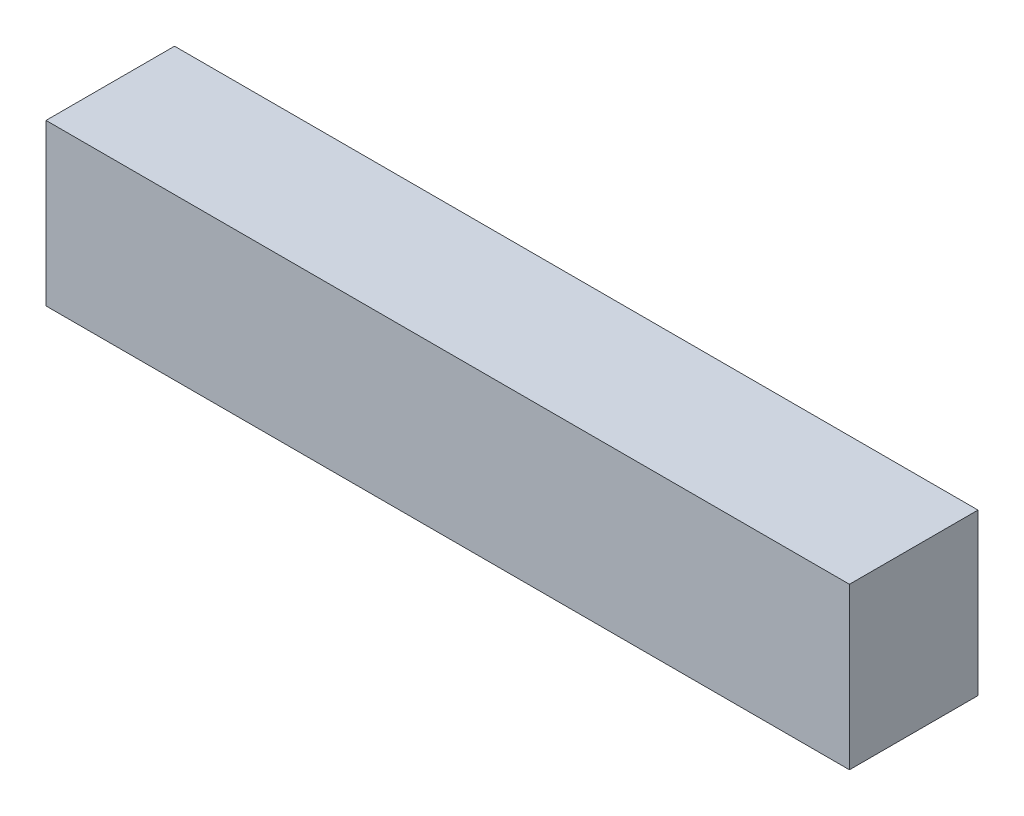
ISO-10303-21;
HEADER;
FILE_DESCRIPTION(('STEP AP214'),'2;1');
FILE_NAME('part.step','',(''),(''),'','','');
FILE_SCHEMA(('AUTOMOTIVE_DESIGN { 1 0 10303 214 1 1 1 1 }'));
ENDSEC;
DATA;
#1=APPLICATION_CONTEXT('core data for automotive mechanical design processes');
#2=APPLICATION_PROTOCOL_DEFINITION('international standard','automotive_design',2000,#1);
#3=PRODUCT_CONTEXT('',#1,'mechanical');
#4=PRODUCT('Part','Part','',(#3));
#5=PRODUCT_RELATED_PRODUCT_CATEGORY('part','',(#4));
#6=PRODUCT_DEFINITION_FORMATION('','',#4);
#7=PRODUCT_DEFINITION_CONTEXT('part definition',#1,'design');
#8=PRODUCT_DEFINITION('design','',#6,#7);
#9=PRODUCT_DEFINITION_SHAPE('','',#8);
#10=(LENGTH_UNIT() NAMED_UNIT(*) SI_UNIT(.MILLI.,.METRE.));
#11=(NAMED_UNIT(*) PLANE_ANGLE_UNIT() SI_UNIT($,.RADIAN.));
#12=(NAMED_UNIT(*) SI_UNIT($,.STERADIAN.) SOLID_ANGLE_UNIT());
#13=UNCERTAINTY_MEASURE_WITH_UNIT(LENGTH_MEASURE(1.E-05),#10,'distance_accuracy_value','');
#14=(GEOMETRIC_REPRESENTATION_CONTEXT(3) GLOBAL_UNCERTAINTY_ASSIGNED_CONTEXT((#13)) GLOBAL_UNIT_ASSIGNED_CONTEXT((#10,
#11,#12)) REPRESENTATION_CONTEXT('',''));
#15=CARTESIAN_POINT('',(0.,0.,0.));
#16=DIRECTION('',(0.,0.,1.));
#17=DIRECTION('',(1.,0.,0.));
#18=AXIS2_PLACEMENT_3D('',#15,#16,#17);
#19=CARTESIAN_POINT('',(0.,0.,0.));
#20=DIRECTION('',(0.,0.,-1.));
#21=DIRECTION('',(-1.,0.,0.));
#22=AXIS2_PLACEMENT_3D('',#19,#20,#21);
#23=PLANE('',#22);
#24=DIRECTION('',(0.,1.,0.));
#25=VECTOR('',#24,1.);
#26=CARTESIAN_POINT('',(0.,0.,0.));
#27=LINE('',#26,#25);
#28=CARTESIAN_POINT('',(0.,0.,0.));
#29=VERTEX_POINT('',#28);
#30=CARTESIAN_POINT('',(0.,10.,0.));
#31=VERTEX_POINT('',#30);
#32=EDGE_CURVE('E111',#29,#31,#27,.T.);
#33=ORIENTED_EDGE('',*,*,#32,.T.);
#34=DIRECTION('',(1.,0.,0.));
#35=VECTOR('',#34,1.);
#36=CARTESIAN_POINT('',(0.,10.,0.));
#37=LINE('',#36,#35);
#38=CARTESIAN_POINT('',(50.,10.,0.));
#39=VERTEX_POINT('',#38);
#40=EDGE_CURVE('E141',#31,#39,#37,.T.);
#41=ORIENTED_EDGE('',*,*,#40,.T.);
#42=DIRECTION('',(0.,1.,0.));
#43=VECTOR('',#42,1.);
#44=CARTESIAN_POINT('',(50.,0.,0.));
#45=LINE('',#44,#43);
#46=CARTESIAN_POINT('',(50.,0.,0.));
#47=VERTEX_POINT('',#46);
#48=EDGE_CURVE('E144',#47,#39,#45,.T.);
#49=ORIENTED_EDGE('',*,*,#48,.F.);
#50=DIRECTION('',(1.,0.,0.));
#51=VECTOR('',#50,1.);
#52=CARTESIAN_POINT('',(0.,0.,0.));
#53=LINE('',#52,#51);
#54=EDGE_CURVE('E88',#29,#47,#53,.T.);
#55=ORIENTED_EDGE('',*,*,#54,.F.);
#56=EDGE_LOOP('',(#33,#41,#49,#55));
#57=FACE_BOUND('',#56,.T.);
#58=CARTESIAN_POINT('',(44.5,5.,0.));
#59=DIRECTION('',(0.,0.,-1.));
#60=DIRECTION('',(-1.,0.,0.));
#61=AXIS2_PLACEMENT_3D('',#58,#59,#60);
#62=CIRCLE('',#61,1.5);
#63=CARTESIAN_POINT('',(43.,5.,0.));
#64=VERTEX_POINT('',#63);
#65=EDGE_CURVE('E134',#64,#64,#62,.T.);
#66=ORIENTED_EDGE('',*,*,#65,.F.);
#67=EDGE_LOOP('',(#66));
#68=FACE_BOUND('',#67,.T.);
#69=CARTESIAN_POINT('',(5.5,5.,0.));
#70=DIRECTION('',(0.,0.,1.));
#71=DIRECTION('',(1.,0.,0.));
#72=AXIS2_PLACEMENT_3D('',#69,#70,#71);
#73=CIRCLE('',#72,1.5);
#74=CARTESIAN_POINT('',(7.,5.,0.));
#75=VERTEX_POINT('',#74);
#76=EDGE_CURVE('E131',#75,#75,#73,.T.);
#77=ORIENTED_EDGE('',*,*,#76,.T.);
#78=EDGE_LOOP('',(#77));
#79=FACE_BOUND('',#78,.T.);
#80=ADVANCED_FACE('F69',(#57,#68,#79),#23,.T.);
#81=CARTESIAN_POINT('',(0.,0.,6.));
#82=DIRECTION('',(-1.,0.,0.));
#83=DIRECTION('',(0.,0.,1.));
#84=AXIS2_PLACEMENT_3D('',#81,#82,#83);
#85=PLANE('',#84);
#86=ORIENTED_EDGE('',*,*,#32,.F.);
#87=DIRECTION('',(0.,0.,-1.));
#88=VECTOR('',#87,1.);
#89=CARTESIAN_POINT('',(0.,0.,6.));
#90=LINE('',#89,#88);
#91=CARTESIAN_POINT('',(0.,0.,8.));
#92=VERTEX_POINT('',#91);
#93=EDGE_CURVE('E12',#92,#29,#90,.T.);
#94=ORIENTED_EDGE('',*,*,#93,.F.);
#95=DIRECTION('',(0.,-1.,0.));
#96=VECTOR('',#95,1.);
#97=CARTESIAN_POINT('',(0.,0.,8.));
#98=LINE('',#97,#96);
#99=CARTESIAN_POINT('',(0.,10.,8.));
#100=VERTEX_POINT('',#99);
#101=EDGE_CURVE('E109',#100,#92,#98,.T.);
#102=ORIENTED_EDGE('',*,*,#101,.F.);
#103=DIRECTION('',(0.,0.,-1.));
#104=VECTOR('',#103,1.);
#105=CARTESIAN_POINT('',(0.,10.,6.));
#106=LINE('',#105,#104);
#107=EDGE_CURVE('E73',#100,#31,#106,.T.);
#108=ORIENTED_EDGE('',*,*,#107,.T.);
#109=EDGE_LOOP('',(#86,#94,#102,#108));
#110=FACE_BOUND('',#109,.T.);
#111=ADVANCED_FACE('F71',(#110),#85,.T.);
#112=CARTESIAN_POINT('',(0.,0.,6.));
#113=DIRECTION('',(0.,1.,0.));
#114=DIRECTION('',(0.,0.,1.));
#115=AXIS2_PLACEMENT_3D('',#112,#113,#114);
#116=PLANE('',#115);
#117=ORIENTED_EDGE('',*,*,#54,.T.);
#118=DIRECTION('',(0.,0.,-1.));
#119=VECTOR('',#118,1.);
#120=CARTESIAN_POINT('',(50.,0.,6.));
#121=LINE('',#120,#119);
#122=CARTESIAN_POINT('',(50.,0.,8.));
#123=VERTEX_POINT('',#122);
#124=EDGE_CURVE('E78',#123,#47,#121,.T.);
#125=ORIENTED_EDGE('',*,*,#124,.F.);
#126=DIRECTION('',(1.,0.,0.));
#127=VECTOR('',#126,1.);
#128=CARTESIAN_POINT('',(0.,0.,8.));
#129=LINE('',#128,#127);
#130=EDGE_CURVE('E113',#92,#123,#129,.T.);
#131=ORIENTED_EDGE('',*,*,#130,.F.);
#132=ORIENTED_EDGE('',*,*,#93,.T.);
#133=EDGE_LOOP('',(#117,#125,#131,#132));
#134=FACE_BOUND('',#133,.T.);
#135=ADVANCED_FACE('F114',(#134),#116,.F.);
#136=CARTESIAN_POINT('',(50.,0.,6.));
#137=DIRECTION('',(-1.,0.,0.));
#138=DIRECTION('',(0.,0.,1.));
#139=AXIS2_PLACEMENT_3D('',#136,#137,#138);
#140=PLANE('',#139);
#141=ORIENTED_EDGE('',*,*,#48,.T.);
#142=DIRECTION('',(0.,0.,-1.));
#143=VECTOR('',#142,1.);
#144=CARTESIAN_POINT('',(50.,10.,6.));
#145=LINE('',#144,#143);
#146=CARTESIAN_POINT('',(50.,10.,8.));
#147=VERTEX_POINT('',#146);
#148=EDGE_CURVE('E148',#147,#39,#145,.T.);
#149=ORIENTED_EDGE('',*,*,#148,.F.);
#150=DIRECTION('',(0.,1.,0.));
#151=VECTOR('',#150,1.);
#152=CARTESIAN_POINT('',(50.,0.,8.));
#153=LINE('',#152,#151);
#154=EDGE_CURVE('E118',#123,#147,#153,.T.);
#155=ORIENTED_EDGE('',*,*,#154,.F.);
#156=ORIENTED_EDGE('',*,*,#124,.T.);
#157=EDGE_LOOP('',(#141,#149,#155,#156));
#158=FACE_BOUND('',#157,.T.);
#159=ADVANCED_FACE('F156',(#158),#140,.F.);
#160=CARTESIAN_POINT('',(0.,10.,6.));
#161=DIRECTION('',(0.,1.,0.));
#162=DIRECTION('',(0.,0.,1.));
#163=AXIS2_PLACEMENT_3D('',#160,#161,#162);
#164=PLANE('',#163);
#165=ORIENTED_EDGE('',*,*,#40,.F.);
#166=ORIENTED_EDGE('',*,*,#107,.F.);
#167=DIRECTION('',(-1.,0.,0.));
#168=VECTOR('',#167,1.);
#169=CARTESIAN_POINT('',(0.,10.,8.));
#170=LINE('',#169,#168);
#171=EDGE_CURVE('E123',#147,#100,#170,.T.);
#172=ORIENTED_EDGE('',*,*,#171,.F.);
#173=ORIENTED_EDGE('',*,*,#148,.T.);
#174=EDGE_LOOP('',(#165,#166,#172,#173));
#175=FACE_BOUND('',#174,.T.);
#176=ADVANCED_FACE('F151',(#175),#164,.T.);
#177=CARTESIAN_POINT('',(44.5,5.,6.));
#178=DIRECTION('',(0.,0.,-1.));
#179=DIRECTION('',(-1.,0.,0.));
#180=AXIS2_PLACEMENT_3D('',#177,#178,#179);
#181=CYLINDRICAL_SURFACE('',#180,1.5);
#182=CARTESIAN_POINT('',(44.5,5.,6.));
#183=DIRECTION('',(0.,0.,-1.));
#184=DIRECTION('',(-1.,0.,0.));
#185=AXIS2_PLACEMENT_3D('',#182,#183,#184);
#186=CIRCLE('',#185,1.5);
#187=CARTESIAN_POINT('',(43.,5.,6.));
#188=VERTEX_POINT('',#187);
#189=EDGE_CURVE('E135',#188,#188,#186,.T.);
#190=ORIENTED_EDGE('',*,*,#189,.F.);
#191=EDGE_LOOP('',(#190));
#192=FACE_BOUND('',#191,.T.);
#193=ORIENTED_EDGE('',*,*,#65,.T.);
#194=EDGE_LOOP('',(#193));
#195=FACE_BOUND('',#194,.T.);
#196=ADVANCED_FACE('F163',(#192,#195),#181,.F.);
#197=CARTESIAN_POINT('',(5.5,5.,6.));
#198=DIRECTION('',(0.,0.,-1.));
#199=DIRECTION('',(-1.,0.,0.));
#200=AXIS2_PLACEMENT_3D('',#197,#198,#199);
#201=CYLINDRICAL_SURFACE('',#200,1.5);
#202=CARTESIAN_POINT('',(5.5,5.,6.));
#203=DIRECTION('',(0.,0.,1.));
#204=DIRECTION('',(1.,0.,0.));
#205=AXIS2_PLACEMENT_3D('',#202,#203,#204);
#206=CIRCLE('',#205,1.5);
#207=CARTESIAN_POINT('',(7.,5.,6.));
#208=VERTEX_POINT('',#207);
#209=EDGE_CURVE('E128',#208,#208,#206,.T.);
#210=ORIENTED_EDGE('',*,*,#209,.T.);
#211=EDGE_LOOP('',(#210));
#212=FACE_BOUND('',#211,.T.);
#213=ORIENTED_EDGE('',*,*,#76,.F.);
#214=EDGE_LOOP('',(#213));
#215=FACE_BOUND('',#214,.T.);
#216=ADVANCED_FACE('F173',(#212,#215),#201,.F.);
#217=CARTESIAN_POINT('',(0.,0.,6.));
#218=DIRECTION('',(0.,0.,-1.));
#219=DIRECTION('',(-1.,0.,0.));
#220=AXIS2_PLACEMENT_3D('',#217,#218,#219);
#221=PLANE('',#220);
#222=ORIENTED_EDGE('',*,*,#209,.F.);
#223=EDGE_LOOP('',(#222));
#224=FACE_BOUND('',#223,.T.);
#225=ADVANCED_FACE('F177',(#224),#221,.T.);
#226=ORIENTED_EDGE('',*,*,#189,.T.);
#227=EDGE_LOOP('',(#226));
#228=FACE_BOUND('',#227,.T.);
#229=ADVANCED_FACE('F179',(#228),#221,.T.);
#230=CARTESIAN_POINT('',(0.,0.,8.));
#231=DIRECTION('',(0.,0.,-1.));
#232=DIRECTION('',(-1.,0.,0.));
#233=AXIS2_PLACEMENT_3D('',#230,#231,#232);
#234=PLANE('',#233);
#235=ORIENTED_EDGE('',*,*,#101,.T.);
#236=ORIENTED_EDGE('',*,*,#130,.T.);
#237=ORIENTED_EDGE('',*,*,#154,.T.);
#238=ORIENTED_EDGE('',*,*,#171,.T.);
#239=EDGE_LOOP('',(#235,#236,#237,#238));
#240=FACE_BOUND('',#239,.T.);
#241=ADVANCED_FACE('F121',(#240),#234,.F.);
#242=CLOSED_SHELL('',(#80,#111,#135,#159,#176,#196,#216,#225,#229,#241));
#243=MANIFOLD_SOLID_BREP('B2',#242);
#244=ADVANCED_BREP_SHAPE_REPRESENTATION('',(#18,#243),#14);
#245=SHAPE_DEFINITION_REPRESENTATION(#9,#244);
ENDSEC;
END-ISO-10303-21;
